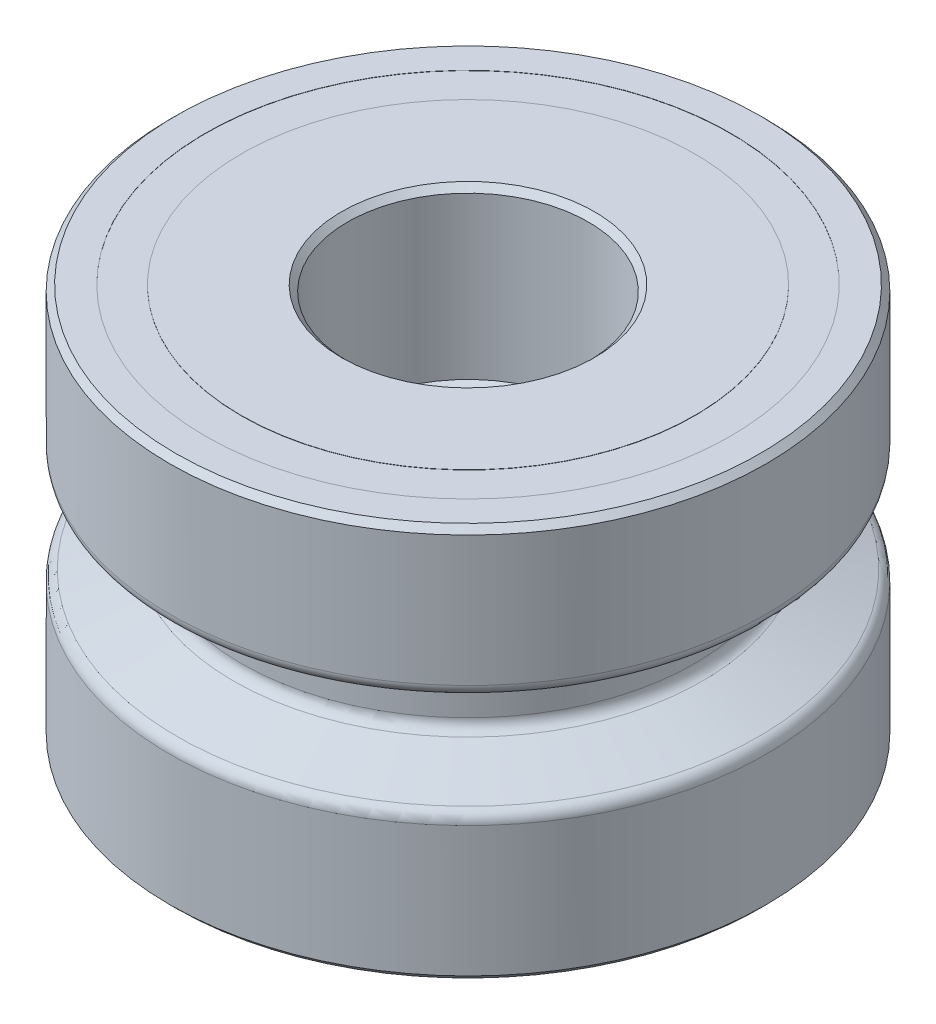
ISO-10303-21;
HEADER;
FILE_DESCRIPTION(('STEP AP214'),'2;1');
FILE_NAME('part.step','',(''),(''),'','','');
FILE_SCHEMA(('AUTOMOTIVE_DESIGN { 1 0 10303 214 1 1 1 1 }'));
ENDSEC;
DATA;
#1=APPLICATION_CONTEXT('core data for automotive mechanical design processes');
#2=APPLICATION_PROTOCOL_DEFINITION('international standard','automotive_design',2000,#1);
#3=PRODUCT_CONTEXT('',#1,'mechanical');
#4=PRODUCT('Part','Part','',(#3));
#5=PRODUCT_RELATED_PRODUCT_CATEGORY('part','',(#4));
#6=PRODUCT_DEFINITION_FORMATION('','',#4);
#7=PRODUCT_DEFINITION_CONTEXT('part definition',#1,'design');
#8=PRODUCT_DEFINITION('design','',#6,#7);
#9=PRODUCT_DEFINITION_SHAPE('','',#8);
#10=(LENGTH_UNIT() NAMED_UNIT(*) SI_UNIT(.MILLI.,.METRE.));
#11=(NAMED_UNIT(*) PLANE_ANGLE_UNIT() SI_UNIT($,.RADIAN.));
#12=(NAMED_UNIT(*) SI_UNIT($,.STERADIAN.) SOLID_ANGLE_UNIT());
#13=UNCERTAINTY_MEASURE_WITH_UNIT(LENGTH_MEASURE(1.E-05),#10,'distance_accuracy_value','');
#14=(GEOMETRIC_REPRESENTATION_CONTEXT(3) GLOBAL_UNCERTAINTY_ASSIGNED_CONTEXT((#13)) GLOBAL_UNIT_ASSIGNED_CONTEXT((#10,
#11,#12)) REPRESENTATION_CONTEXT('',''));
#15=CARTESIAN_POINT('',(0.,0.,0.));
#16=DIRECTION('',(0.,0.,1.));
#17=DIRECTION('',(1.,0.,0.));
#18=AXIS2_PLACEMENT_3D('',#15,#16,#17);
#19=CARTESIAN_POINT('',(0.,8.25,0.));
#20=DIRECTION('',(0.,-1.,0.));
#21=DIRECTION('',(0.,0.,-1.));
#22=AXIS2_PLACEMENT_3D('',#19,#20,#21);
#23=CYLINDRICAL_SURFACE('',#22,12.5);
#24=CARTESIAN_POINT('',(0.,-8.,0.));
#25=DIRECTION('',(0.,1.,0.));
#26=DIRECTION('',(0.,0.,1.));
#27=AXIS2_PLACEMENT_3D('',#24,#25,#26);
#28=CIRCLE('',#27,12.5);
#29=CARTESIAN_POINT('',(0.,-8.,12.5));
#30=VERTEX_POINT('',#29);
#31=EDGE_CURVE('E60',#30,#30,#28,.T.);
#32=ORIENTED_EDGE('',*,*,#31,.T.);
#33=EDGE_LOOP('',(#32));
#34=FACE_BOUND('',#33,.T.);
#35=CARTESIAN_POINT('',(0.,-2.54201447190344,0.));
#36=DIRECTION('',(0.,-1.,0.));
#37=DIRECTION('',(0.,0.,-1.));
#38=AXIS2_PLACEMENT_3D('',#35,#36,#37);
#39=CIRCLE('',#38,12.5);
#40=CARTESIAN_POINT('',(0.,-2.54201447190344,-12.5));
#41=VERTEX_POINT('',#40);
#42=EDGE_CURVE('E81',#41,#41,#39,.T.);
#43=ORIENTED_EDGE('',*,*,#42,.T.);
#44=EDGE_LOOP('',(#43));
#45=FACE_BOUND('',#44,.T.);
#46=ADVANCED_FACE('F44',(#34,#45),#23,.T.);
#47=CARTESIAN_POINT('',(0.,7.99999999999999,0.));
#48=DIRECTION('',(0.,1.,0.));
#49=DIRECTION('',(0.,0.,1.));
#50=AXIS2_PLACEMENT_3D('',#47,#48,#49);
#51=CIRCLE('',#50,12.5);
#52=CARTESIAN_POINT('',(0.,7.99999999999999,12.5));
#53=VERTEX_POINT('',#52);
#54=EDGE_CURVE('E10',#53,#53,#51,.F.);
#55=ORIENTED_EDGE('',*,*,#54,.T.);
#56=EDGE_LOOP('',(#55));
#57=FACE_BOUND('',#56,.T.);
#58=CARTESIAN_POINT('',(0.,2.54201447190344,0.));
#59=DIRECTION('',(0.,-1.,0.));
#60=DIRECTION('',(0.,0.,-1.));
#61=AXIS2_PLACEMENT_3D('',#58,#59,#60);
#62=CIRCLE('',#61,12.5);
#63=CARTESIAN_POINT('',(0.,2.54201447190344,-12.5));
#64=VERTEX_POINT('',#63);
#65=EDGE_CURVE('E90',#64,#64,#62,.F.);
#66=ORIENTED_EDGE('',*,*,#65,.T.);
#67=EDGE_LOOP('',(#66));
#68=FACE_BOUND('',#67,.T.);
#69=ADVANCED_FACE('F162',(#57,#68),#23,.T.);
#70=CARTESIAN_POINT('',(0.,8.25,0.));
#71=DIRECTION('',(0.,1.,0.));
#72=DIRECTION('',(0.,0.,1.));
#73=AXIS2_PLACEMENT_3D('',#70,#71,#72);
#74=PLANE('',#73);
#75=CARTESIAN_POINT('',(0.,8.25,0.));
#76=DIRECTION('',(0.,1.,0.));
#77=DIRECTION('',(0.,0.,1.));
#78=AXIS2_PLACEMENT_3D('',#75,#76,#77);
#79=CIRCLE('',#78,5.30000000000001);
#80=CARTESIAN_POINT('',(0.,8.25,5.30000000000001));
#81=VERTEX_POINT('',#80);
#82=EDGE_CURVE('E62',#81,#81,#79,.F.);
#83=ORIENTED_EDGE('',*,*,#82,.T.);
#84=EDGE_LOOP('',(#83));
#85=FACE_BOUND('',#84,.T.);
#86=CARTESIAN_POINT('',(0.,8.25,0.));
#87=DIRECTION('',(0.,1.,0.));
#88=DIRECTION('',(0.,0.,1.));
#89=AXIS2_PLACEMENT_3D('',#86,#87,#88);
#90=CIRCLE('',#89,9.5);
#91=CARTESIAN_POINT('',(0.,8.25,9.5));
#92=VERTEX_POINT('',#91);
#93=EDGE_CURVE('E125',#92,#92,#90,.T.);
#94=ORIENTED_EDGE('',*,*,#93,.T.);
#95=EDGE_LOOP('',(#94));
#96=FACE_BOUND('',#95,.T.);
#97=ADVANCED_FACE('F151',(#85,#96),#74,.T.);
#98=CARTESIAN_POINT('',(0.,8.251,0.));
#99=DIRECTION('',(0.,-1.,0.));
#100=DIRECTION('',(0.,0.,-1.));
#101=AXIS2_PLACEMENT_3D('',#98,#99,#100);
#102=CYLINDRICAL_SURFACE('',#101,4.);
#103=CARTESIAN_POINT('',(0.,-4.00000000000001,0.));
#104=DIRECTION('',(0.,-1.,0.));
#105=DIRECTION('',(0.,0.,-1.));
#106=AXIS2_PLACEMENT_3D('',#103,#104,#105);
#107=CIRCLE('',#106,4.);
#108=CARTESIAN_POINT('',(0.,-4.00000000000001,-4.));
#109=VERTEX_POINT('',#108);
#110=EDGE_CURVE('E76',#109,#109,#107,.T.);
#111=ORIENTED_EDGE('',*,*,#110,.T.);
#112=EDGE_LOOP('',(#111));
#113=FACE_BOUND('',#112,.T.);
#114=CARTESIAN_POINT('',(0.,0.749999999999993,0.));
#115=DIRECTION('',(0.,1.,0.));
#116=DIRECTION('',(0.,0.,1.));
#117=AXIS2_PLACEMENT_3D('',#114,#115,#116);
#118=CIRCLE('',#117,4.);
#119=CARTESIAN_POINT('',(0.,0.749999999999993,4.));
#120=VERTEX_POINT('',#119);
#121=EDGE_CURVE('E111',#120,#120,#118,.T.);
#122=ORIENTED_EDGE('',*,*,#121,.T.);
#123=EDGE_LOOP('',(#122));
#124=FACE_BOUND('',#123,.T.);
#125=ADVANCED_FACE('F146',(#113,#124),#102,.F.);
#126=CARTESIAN_POINT('',(0.,8.25,0.));
#127=DIRECTION('',(0.,1.,0.));
#128=DIRECTION('',(0.,0.,1.));
#129=AXIS2_PLACEMENT_3D('',#126,#127,#128);
#130=CIRCLE('',#129,12.25);
#131=CARTESIAN_POINT('',(0.,8.25,12.25));
#132=VERTEX_POINT('',#131);
#133=EDGE_CURVE('E52',#132,#132,#130,.T.);
#134=ORIENTED_EDGE('',*,*,#133,.T.);
#135=EDGE_LOOP('',(#134));
#136=FACE_BOUND('',#135,.T.);
#137=CARTESIAN_POINT('',(0.,8.25,0.));
#138=DIRECTION('',(0.,1.,0.));
#139=DIRECTION('',(0.,0.,1.));
#140=AXIS2_PLACEMENT_3D('',#137,#138,#139);
#141=CIRCLE('',#140,11.);
#142=CARTESIAN_POINT('',(0.,8.25,11.));
#143=VERTEX_POINT('',#142);
#144=EDGE_CURVE('E117',#143,#143,#141,.T.);
#145=ORIENTED_EDGE('',*,*,#144,.F.);
#146=EDGE_LOOP('',(#145));
#147=FACE_BOUND('',#146,.T.);
#148=ADVANCED_FACE('F147',(#136,#147),#74,.T.);
#149=CARTESIAN_POINT('',(0.,-8.25,0.));
#150=DIRECTION('',(0.,1.,0.));
#151=DIRECTION('',(0.,0.,1.));
#152=AXIS2_PLACEMENT_3D('',#149,#150,#151);
#153=PLANE('',#152);
#154=CARTESIAN_POINT('',(0.,-8.25,0.));
#155=DIRECTION('',(0.,1.,0.));
#156=DIRECTION('',(0.,0.,1.));
#157=AXIS2_PLACEMENT_3D('',#154,#155,#156);
#158=CIRCLE('',#157,5.30000000000001);
#159=CARTESIAN_POINT('',(0.,-8.25,5.30000000000001));
#160=VERTEX_POINT('',#159);
#161=EDGE_CURVE('E67',#160,#160,#158,.T.);
#162=ORIENTED_EDGE('',*,*,#161,.T.);
#163=EDGE_LOOP('',(#162));
#164=FACE_BOUND('',#163,.T.);
#165=CARTESIAN_POINT('',(0.,-8.25,0.));
#166=DIRECTION('',(0.,1.,0.));
#167=DIRECTION('',(0.,0.,1.));
#168=AXIS2_PLACEMENT_3D('',#165,#166,#167);
#169=CIRCLE('',#168,12.25);
#170=CARTESIAN_POINT('',(0.,-8.25,12.25));
#171=VERTEX_POINT('',#170);
#172=EDGE_CURVE('E71',#171,#171,#169,.F.);
#173=ORIENTED_EDGE('',*,*,#172,.T.);
#174=EDGE_LOOP('',(#173));
#175=FACE_BOUND('',#174,.T.);
#176=ADVANCED_FACE('F150',(#164,#175),#153,.F.);
#177=CARTESIAN_POINT('',(0.,-4.25,0.));
#178=DIRECTION('',(0.,-1.,0.));
#179=DIRECTION('',(0.,0.,-1.));
#180=AXIS2_PLACEMENT_3D('',#177,#178,#179);
#181=PLANE('',#180);
#182=CARTESIAN_POINT('',(0.,-4.25,0.));
#183=DIRECTION('',(0.,-1.,0.));
#184=DIRECTION('',(0.,0.,-1.));
#185=AXIS2_PLACEMENT_3D('',#182,#183,#184);
#186=CIRCLE('',#185,4.24999999999999);
#187=CARTESIAN_POINT('',(0.,-4.25,-4.24999999999999));
#188=VERTEX_POINT('',#187);
#189=EDGE_CURVE('E82',#188,#188,#186,.F.);
#190=ORIENTED_EDGE('',*,*,#189,.T.);
#191=EDGE_LOOP('',(#190));
#192=FACE_BOUND('',#191,.T.);
#193=CARTESIAN_POINT('',(0.,-4.25,0.));
#194=DIRECTION('',(0.,-1.,0.));
#195=DIRECTION('',(0.,0.,-1.));
#196=AXIS2_PLACEMENT_3D('',#193,#194,#195);
#197=CIRCLE('',#196,5.05);
#198=CARTESIAN_POINT('',(0.,-4.25,-5.05));
#199=VERTEX_POINT('',#198);
#200=EDGE_CURVE('E112',#199,#199,#197,.T.);
#201=ORIENTED_EDGE('',*,*,#200,.T.);
#202=EDGE_LOOP('',(#201));
#203=FACE_BOUND('',#202,.T.);
#204=ADVANCED_FACE('F159',(#192,#203),#181,.T.);
#205=CARTESIAN_POINT('',(0.,-4.25,0.));
#206=DIRECTION('',(0.,-1.,0.));
#207=DIRECTION('',(0.,0.,-1.));
#208=AXIS2_PLACEMENT_3D('',#205,#206,#207);
#209=CYLINDRICAL_SURFACE('',#208,5.05);
#210=CARTESIAN_POINT('',(0.,-8.,0.));
#211=DIRECTION('',(0.,1.,0.));
#212=DIRECTION('',(0.,0.,1.));
#213=AXIS2_PLACEMENT_3D('',#210,#211,#212);
#214=CIRCLE('',#213,5.05);
#215=CARTESIAN_POINT('',(0.,-8.,5.05));
#216=VERTEX_POINT('',#215);
#217=EDGE_CURVE('E72',#216,#216,#214,.F.);
#218=ORIENTED_EDGE('',*,*,#217,.T.);
#219=EDGE_LOOP('',(#218));
#220=FACE_BOUND('',#219,.T.);
#221=ORIENTED_EDGE('',*,*,#200,.F.);
#222=EDGE_LOOP('',(#221));
#223=FACE_BOUND('',#222,.T.);
#224=ADVANCED_FACE('F363',(#220,#223),#209,.F.);
#225=CARTESIAN_POINT('',(0.,1.25,0.));
#226=DIRECTION('',(0.,1.,0.));
#227=DIRECTION('',(0.,0.,1.));
#228=AXIS2_PLACEMENT_3D('',#225,#226,#227);
#229=CYLINDRICAL_SURFACE('',#228,5.05);
#230=CARTESIAN_POINT('',(0.,8.,0.));
#231=DIRECTION('',(0.,1.,0.));
#232=DIRECTION('',(0.,0.,1.));
#233=AXIS2_PLACEMENT_3D('',#230,#231,#232);
#234=CIRCLE('',#233,5.05);
#235=CARTESIAN_POINT('',(0.,8.,5.05));
#236=VERTEX_POINT('',#235);
#237=EDGE_CURVE('E66',#236,#236,#234,.T.);
#238=ORIENTED_EDGE('',*,*,#237,.T.);
#239=EDGE_LOOP('',(#238));
#240=FACE_BOUND('',#239,.T.);
#241=CARTESIAN_POINT('',(0.,1.23962304106274,0.));
#242=DIRECTION('',(0.,1.,0.));
#243=DIRECTION('',(0.,0.,1.));
#244=AXIS2_PLACEMENT_3D('',#241,#242,#243);
#245=CIRCLE('',#244,5.05);
#246=CARTESIAN_POINT('',(0.,1.23962304106274,5.05));
#247=VERTEX_POINT('',#246);
#248=EDGE_CURVE('E108',#247,#247,#245,.F.);
#249=ORIENTED_EDGE('',*,*,#248,.T.);
#250=EDGE_LOOP('',(#249));
#251=FACE_BOUND('',#250,.T.);
#252=ADVANCED_FACE('F350',(#240,#251),#229,.F.);
#253=CARTESIAN_POINT('',(0.,8.24,0.));
#254=DIRECTION('',(0.,1.,0.));
#255=DIRECTION('',(0.,0.,1.));
#256=AXIS2_PLACEMENT_3D('',#253,#254,#255);
#257=CYLINDRICAL_SURFACE('',#256,9.5);
#258=CARTESIAN_POINT('',(0.,8.24,0.));
#259=DIRECTION('',(0.,1.,0.));
#260=DIRECTION('',(0.,0.,1.));
#261=AXIS2_PLACEMENT_3D('',#258,#259,#260);
#262=CIRCLE('',#261,9.5);
#263=CARTESIAN_POINT('',(0.,8.24,9.5));
#264=VERTEX_POINT('',#263);
#265=EDGE_CURVE('E122',#264,#264,#262,.T.);
#266=CARTESIAN_POINT('',(0.,8.24,9.5));
#267=CARTESIAN_POINT('',(0.,8.24010416666667,9.5));
#268=CARTESIAN_POINT('',(0.,8.24020833333333,9.5));
#269=CARTESIAN_POINT('',(0.,8.24041666666667,9.5));
#270=CARTESIAN_POINT('',(0.,8.24052083333333,9.5));
#271=CARTESIAN_POINT('',(0.,8.24072916666667,9.5));
#272=CARTESIAN_POINT('',(0.,8.24083333333333,9.5));
#273=CARTESIAN_POINT('',(0.,8.24104166666667,9.5));
#274=CARTESIAN_POINT('',(0.,8.24114583333333,9.5));
#275=CARTESIAN_POINT('',(0.,8.24135416666667,9.5));
#276=CARTESIAN_POINT('',(0.,8.24145833333333,9.5));
#277=CARTESIAN_POINT('',(0.,8.24166666666667,9.5));
#278=CARTESIAN_POINT('',(0.,8.24177083333333,9.5));
#279=CARTESIAN_POINT('',(0.,8.24197916666667,9.5));
#280=CARTESIAN_POINT('',(0.,8.24208333333333,9.5));
#281=CARTESIAN_POINT('',(0.,8.24229166666667,9.5));
#282=CARTESIAN_POINT('',(0.,8.24239583333333,9.5));
#283=CARTESIAN_POINT('',(0.,8.24260416666667,9.5));
#284=CARTESIAN_POINT('',(0.,8.24270833333333,9.5));
#285=CARTESIAN_POINT('',(0.,8.24291666666667,9.5));
#286=CARTESIAN_POINT('',(0.,8.24302083333333,9.5));
#287=CARTESIAN_POINT('',(0.,8.24322916666667,9.5));
#288=CARTESIAN_POINT('',(0.,8.24333333333333,9.5));
#289=CARTESIAN_POINT('',(0.,8.24354166666667,9.5));
#290=CARTESIAN_POINT('',(0.,8.24364583333333,9.5));
#291=CARTESIAN_POINT('',(0.,8.24385416666667,9.5));
#292=CARTESIAN_POINT('',(0.,8.24395833333333,9.5));
#293=CARTESIAN_POINT('',(0.,8.24416666666667,9.5));
#294=CARTESIAN_POINT('',(0.,8.24427083333333,9.5));
#295=CARTESIAN_POINT('',(0.,8.24447916666667,9.5));
#296=CARTESIAN_POINT('',(0.,8.24458333333333,9.5));
#297=CARTESIAN_POINT('',(0.,8.24479166666667,9.5));
#298=CARTESIAN_POINT('',(0.,8.24489583333333,9.5));
#299=CARTESIAN_POINT('',(0.,8.24510416666667,9.5));
#300=CARTESIAN_POINT('',(0.,8.24520833333333,9.5));
#301=CARTESIAN_POINT('',(0.,8.24541666666667,9.5));
#302=CARTESIAN_POINT('',(0.,8.24552083333333,9.5));
#303=CARTESIAN_POINT('',(0.,8.24572916666667,9.5));
#304=CARTESIAN_POINT('',(0.,8.24583333333333,9.5));
#305=CARTESIAN_POINT('',(0.,8.24604166666667,9.5));
#306=CARTESIAN_POINT('',(0.,8.24614583333333,9.5));
#307=CARTESIAN_POINT('',(0.,8.24635416666667,9.5));
#308=CARTESIAN_POINT('',(0.,8.24645833333333,9.5));
#309=CARTESIAN_POINT('',(0.,8.24666666666667,9.5));
#310=CARTESIAN_POINT('',(0.,8.24677083333333,9.5));
#311=CARTESIAN_POINT('',(0.,8.24697916666667,9.5));
#312=CARTESIAN_POINT('',(0.,8.24708333333333,9.5));
#313=CARTESIAN_POINT('',(0.,8.24729166666667,9.5));
#314=CARTESIAN_POINT('',(0.,8.24739583333333,9.5));
#315=CARTESIAN_POINT('',(0.,8.24760416666667,9.5));
#316=CARTESIAN_POINT('',(0.,8.24770833333333,9.5));
#317=CARTESIAN_POINT('',(0.,8.24791666666667,9.5));
#318=CARTESIAN_POINT('',(0.,8.24802083333333,9.5));
#319=CARTESIAN_POINT('',(0.,8.24822916666667,9.5));
#320=CARTESIAN_POINT('',(0.,8.24833333333333,9.5));
#321=CARTESIAN_POINT('',(0.,8.24854166666667,9.5));
#322=CARTESIAN_POINT('',(0.,8.24864583333333,9.5));
#323=CARTESIAN_POINT('',(0.,8.24885416666667,9.5));
#324=CARTESIAN_POINT('',(0.,8.24895833333333,9.5));
#325=CARTESIAN_POINT('',(0.,8.24916666666667,9.5));
#326=CARTESIAN_POINT('',(0.,8.24927083333333,9.5));
#327=CARTESIAN_POINT('',(0.,8.24947916666667,9.5));
#328=CARTESIAN_POINT('',(0.,8.24958333333333,9.5));
#329=CARTESIAN_POINT('',(0.,8.24979166666667,9.5));
#330=CARTESIAN_POINT('',(0.,8.24989583333333,9.5));
#331=CARTESIAN_POINT('',(0.,8.25,9.5));
#332=B_SPLINE_CURVE_WITH_KNOTS('',3,(#266,#267,#268,#269,#270,#271,#272,#273,#274,#275,#276,
#277,#278,#279,#280,#281,#282,#283,#284,#285,#286,#287,#288,#289,#290,#291,#292,#293,#294,#295,
#296,#297,#298,#299,#300,#301,#302,#303,#304,#305,#306,#307,#308,#309,#310,#311,#312,#313,#314,
#315,#316,#317,#318,#319,#320,#321,#322,#323,#324,#325,#326,#327,#328,#329,#330,#331),
.UNSPECIFIED.,.F.,.F.,(4,2,2,2,2,2,2,2,2,2,2,2,2,2,2,2,2,2,2,2,2,2,2,2,2,2,2,2,2,2,2,2,4),(0.,
0.000312499999998578,0.00062499999999889,0.000937499999999203,0.00124999999999952,
0.00156249999999983,0.00187499999999841,0.00218749999999872,0.00249999999999903,
0.00281249999999934,0.00312499999999966,0.00343749999999823,0.00374999999999855,
0.00406249999999886,0.00437499999999917,0.00468749999999948,0.00499999999999806,
0.00531249999999837,0.00562499999999869,0.005937499999999,0.00624999999999931,
0.00656249999999962,0.0068749999999982,0.00718749999999851,0.00749999999999883,
0.00781249999999914,0.00812499999999945,0.00843749999999803,0.00874999999999834,
0.00906249999999865,0.00937499999999897,0.00968749999999928,0.00999999999999786),.UNSPECIFIED.);
#333=EDGE_CURVE('BSEAM128',#264,#92,#332,.T.);
#334=ORIENTED_EDGE('',*,*,#265,.T.);
#335=ORIENTED_EDGE('',*,*,#93,.F.);
#336=ORIENTED_EDGE('',*,*,#333,.T.);
#337=ORIENTED_EDGE('',*,*,#333,.F.);
#338=EDGE_LOOP('',(#334,#336,#335,#337));
#339=FACE_BOUND('',#338,.T.);
#340=ADVANCED_FACE('F128',(#339),#257,.T.);
#341=CARTESIAN_POINT('',(0.,8.24,0.));
#342=DIRECTION('',(0.,1.,0.));
#343=DIRECTION('',(0.,0.,1.));
#344=AXIS2_PLACEMENT_3D('',#341,#342,#343);
#345=CYLINDRICAL_SURFACE('',#344,11.);
#346=CARTESIAN_POINT('',(0.,8.24,0.));
#347=DIRECTION('',(0.,1.,0.));
#348=DIRECTION('',(0.,0.,1.));
#349=AXIS2_PLACEMENT_3D('',#346,#347,#348);
#350=CIRCLE('',#349,11.);
#351=CARTESIAN_POINT('',(0.,8.24,11.));
#352=VERTEX_POINT('',#351);
#353=EDGE_CURVE('E120',#352,#352,#350,.T.);
#354=CARTESIAN_POINT('',(0.,8.24,11.));
#355=CARTESIAN_POINT('',(0.,8.24010416666667,11.));
#356=CARTESIAN_POINT('',(0.,8.24020833333333,11.));
#357=CARTESIAN_POINT('',(0.,8.24041666666667,11.));
#358=CARTESIAN_POINT('',(0.,8.24052083333333,11.));
#359=CARTESIAN_POINT('',(0.,8.24072916666667,11.));
#360=CARTESIAN_POINT('',(0.,8.24083333333333,11.));
#361=CARTESIAN_POINT('',(0.,8.24104166666667,11.));
#362=CARTESIAN_POINT('',(0.,8.24114583333333,11.));
#363=CARTESIAN_POINT('',(0.,8.24135416666667,11.));
#364=CARTESIAN_POINT('',(0.,8.24145833333333,11.));
#365=CARTESIAN_POINT('',(0.,8.24166666666667,11.));
#366=CARTESIAN_POINT('',(0.,8.24177083333333,11.));
#367=CARTESIAN_POINT('',(0.,8.24197916666667,11.));
#368=CARTESIAN_POINT('',(0.,8.24208333333333,11.));
#369=CARTESIAN_POINT('',(0.,8.24229166666667,11.));
#370=CARTESIAN_POINT('',(0.,8.24239583333333,11.));
#371=CARTESIAN_POINT('',(0.,8.24260416666667,11.));
#372=CARTESIAN_POINT('',(0.,8.24270833333333,11.));
#373=CARTESIAN_POINT('',(0.,8.24291666666667,11.));
#374=CARTESIAN_POINT('',(0.,8.24302083333333,11.));
#375=CARTESIAN_POINT('',(0.,8.24322916666667,11.));
#376=CARTESIAN_POINT('',(0.,8.24333333333333,11.));
#377=CARTESIAN_POINT('',(0.,8.24354166666667,11.));
#378=CARTESIAN_POINT('',(0.,8.24364583333333,11.));
#379=CARTESIAN_POINT('',(0.,8.24385416666667,11.));
#380=CARTESIAN_POINT('',(0.,8.24395833333333,11.));
#381=CARTESIAN_POINT('',(0.,8.24416666666667,11.));
#382=CARTESIAN_POINT('',(0.,8.24427083333333,11.));
#383=CARTESIAN_POINT('',(0.,8.24447916666667,11.));
#384=CARTESIAN_POINT('',(0.,8.24458333333333,11.));
#385=CARTESIAN_POINT('',(0.,8.24479166666667,11.));
#386=CARTESIAN_POINT('',(0.,8.24489583333333,11.));
#387=CARTESIAN_POINT('',(0.,8.24510416666667,11.));
#388=CARTESIAN_POINT('',(0.,8.24520833333333,11.));
#389=CARTESIAN_POINT('',(0.,8.24541666666667,11.));
#390=CARTESIAN_POINT('',(0.,8.24552083333333,11.));
#391=CARTESIAN_POINT('',(0.,8.24572916666667,11.));
#392=CARTESIAN_POINT('',(0.,8.24583333333333,11.));
#393=CARTESIAN_POINT('',(0.,8.24604166666667,11.));
#394=CARTESIAN_POINT('',(0.,8.24614583333333,11.));
#395=CARTESIAN_POINT('',(0.,8.24635416666667,11.));
#396=CARTESIAN_POINT('',(0.,8.24645833333333,11.));
#397=CARTESIAN_POINT('',(0.,8.24666666666667,11.));
#398=CARTESIAN_POINT('',(0.,8.24677083333333,11.));
#399=CARTESIAN_POINT('',(0.,8.24697916666667,11.));
#400=CARTESIAN_POINT('',(0.,8.24708333333333,11.));
#401=CARTESIAN_POINT('',(0.,8.24729166666667,11.));
#402=CARTESIAN_POINT('',(0.,8.24739583333333,11.));
#403=CARTESIAN_POINT('',(0.,8.24760416666667,11.));
#404=CARTESIAN_POINT('',(0.,8.24770833333333,11.));
#405=CARTESIAN_POINT('',(0.,8.24791666666667,11.));
#406=CARTESIAN_POINT('',(0.,8.24802083333333,11.));
#407=CARTESIAN_POINT('',(0.,8.24822916666667,11.));
#408=CARTESIAN_POINT('',(0.,8.24833333333333,11.));
#409=CARTESIAN_POINT('',(0.,8.24854166666667,11.));
#410=CARTESIAN_POINT('',(0.,8.24864583333333,11.));
#411=CARTESIAN_POINT('',(0.,8.24885416666667,11.));
#412=CARTESIAN_POINT('',(0.,8.24895833333333,11.));
#413=CARTESIAN_POINT('',(0.,8.24916666666667,11.));
#414=CARTESIAN_POINT('',(0.,8.24927083333333,11.));
#415=CARTESIAN_POINT('',(0.,8.24947916666667,11.));
#416=CARTESIAN_POINT('',(0.,8.24958333333333,11.));
#417=CARTESIAN_POINT('',(0.,8.24979166666667,11.));
#418=CARTESIAN_POINT('',(0.,8.24989583333333,11.));
#419=CARTESIAN_POINT('',(0.,8.25,11.));
#420=B_SPLINE_CURVE_WITH_KNOTS('',3,(#354,#355,#356,#357,#358,#359,#360,#361,#362,#363,#364,
#365,#366,#367,#368,#369,#370,#371,#372,#373,#374,#375,#376,#377,#378,#379,#380,#381,#382,#383,
#384,#385,#386,#387,#388,#389,#390,#391,#392,#393,#394,#395,#396,#397,#398,#399,#400,#401,#402,
#403,#404,#405,#406,#407,#408,#409,#410,#411,#412,#413,#414,#415,#416,#417,#418,#419),
.UNSPECIFIED.,.F.,.F.,(4,2,2,2,2,2,2,2,2,2,2,2,2,2,2,2,2,2,2,2,2,2,2,2,2,2,2,2,2,2,2,2,4),(0.,
0.000312499999998578,0.00062499999999889,0.000937499999999203,0.00124999999999952,
0.00156249999999983,0.00187499999999841,0.00218749999999872,0.00249999999999903,
0.00281249999999934,0.00312499999999966,0.00343749999999823,0.00374999999999855,
0.00406249999999886,0.00437499999999917,0.00468749999999948,0.00499999999999806,
0.00531249999999837,0.00562499999999869,0.005937499999999,0.00624999999999931,
0.00656249999999962,0.0068749999999982,0.00718749999999851,0.00749999999999883,
0.00781249999999914,0.00812499999999945,0.00843749999999803,0.00874999999999834,
0.00906249999999865,0.00937499999999897,0.00968749999999928,0.00999999999999786),.UNSPECIFIED.);
#421=EDGE_CURVE('BSEAM136',#352,#143,#420,.T.);
#422=ORIENTED_EDGE('',*,*,#353,.F.);
#423=ORIENTED_EDGE('',*,*,#144,.T.);
#424=ORIENTED_EDGE('',*,*,#421,.T.);
#425=ORIENTED_EDGE('',*,*,#421,.F.);
#426=EDGE_LOOP('',(#422,#424,#423,#425));
#427=FACE_BOUND('',#426,.T.);
#428=ADVANCED_FACE('F136',(#427),#345,.F.);
#429=CARTESIAN_POINT('',(0.,8.24,0.));
#430=DIRECTION('',(0.,1.,0.));
#431=DIRECTION('',(0.,0.,1.));
#432=AXIS2_PLACEMENT_3D('',#429,#430,#431);
#433=PLANE('',#432);
#434=ORIENTED_EDGE('',*,*,#265,.F.);
#435=EDGE_LOOP('',(#434));
#436=FACE_BOUND('',#435,.T.);
#437=ORIENTED_EDGE('',*,*,#353,.T.);
#438=EDGE_LOOP('',(#437));
#439=FACE_BOUND('',#438,.T.);
#440=ADVANCED_FACE('F133',(#436,#439),#433,.T.);
#441=CARTESIAN_POINT('',(0.,-1.1,0.));
#442=DIRECTION('',(0.,-1.,0.));
#443=DIRECTION('',(0.,0.,-1.));
#444=AXIS2_PLACEMENT_3D('',#441,#442,#443);
#445=CONICAL_SURFACE('',#444,9.5,1.22173047639604);
#446=CARTESIAN_POINT('',(0.,-1.2197425412881,0.));
#447=DIRECTION('',(0.,-1.,0.));
#448=DIRECTION('',(0.,0.,-1.));
#449=AXIS2_PLACEMENT_3D('',#446,#447,#448);
#450=CIRCLE('',#449,9.82898992833717);
#451=CARTESIAN_POINT('',(0.,-1.2197425412881,-9.82898992833717));
#452=VERTEX_POINT('',#451);
#453=EDGE_CURVE('E98',#452,#452,#450,.T.);
#454=ORIENTED_EDGE('',*,*,#453,.T.);
#455=EDGE_LOOP('',(#454));
#456=FACE_BOUND('',#455,.T.);
#457=CARTESIAN_POINT('',(0.,-2.07216816151048,0.));
#458=DIRECTION('',(0.,-1.,0.));
#459=DIRECTION('',(0.,0.,-1.));
#460=AXIS2_PLACEMENT_3D('',#457,#458,#459);
#461=CIRCLE('',#460,12.1710100716628);
#462=CARTESIAN_POINT('',(0.,-2.07216816151048,-12.1710100716628));
#463=VERTEX_POINT('',#462);
#464=EDGE_CURVE('E100',#463,#463,#461,.F.);
#465=ORIENTED_EDGE('',*,*,#464,.T.);
#466=EDGE_LOOP('',(#465));
#467=FACE_BOUND('',#466,.T.);
#468=ADVANCED_FACE('F139',(#456,#467),#445,.T.);
#469=CARTESIAN_POINT('',(0.,8.25,0.));
#470=DIRECTION('',(0.,1.,0.));
#471=DIRECTION('',(0.,0.,1.));
#472=AXIS2_PLACEMENT_3D('',#469,#470,#471);
#473=CYLINDRICAL_SURFACE('',#472,9.5);
#474=CARTESIAN_POINT('',(0.,-0.749896230895143,0.));
#475=DIRECTION('',(0.,1.,0.));
#476=DIRECTION('',(0.,0.,1.));
#477=AXIS2_PLACEMENT_3D('',#474,#475,#476);
#478=CIRCLE('',#477,9.5);
#479=CARTESIAN_POINT('',(0.,-0.749896230895143,9.5));
#480=VERTEX_POINT('',#479);
#481=EDGE_CURVE('E105',#480,#480,#478,.T.);
#482=ORIENTED_EDGE('',*,*,#481,.T.);
#483=EDGE_LOOP('',(#482));
#484=FACE_BOUND('',#483,.T.);
#485=CARTESIAN_POINT('',(0.,0.749896230895143,0.));
#486=DIRECTION('',(0.,1.,0.));
#487=DIRECTION('',(0.,0.,1.));
#488=AXIS2_PLACEMENT_3D('',#485,#486,#487);
#489=CIRCLE('',#488,9.5);
#490=CARTESIAN_POINT('',(0.,0.749896230895143,9.5));
#491=VERTEX_POINT('',#490);
#492=EDGE_CURVE('E102',#491,#491,#489,.F.);
#493=ORIENTED_EDGE('',*,*,#492,.T.);
#494=EDGE_LOOP('',(#493));
#495=FACE_BOUND('',#494,.T.);
#496=ADVANCED_FACE('F296',(#484,#495),#473,.T.);
#497=CARTESIAN_POINT('',(0.,2.19191070279859,0.));
#498=DIRECTION('',(0.,1.,0.));
#499=DIRECTION('',(0.,0.,1.));
#500=AXIS2_PLACEMENT_3D('',#497,#498,#499);
#501=CONICAL_SURFACE('',#500,12.5,1.22173047639604);
#502=CARTESIAN_POINT('',(0.,1.2197425412881,0.));
#503=DIRECTION('',(0.,1.,0.));
#504=DIRECTION('',(0.,0.,1.));
#505=AXIS2_PLACEMENT_3D('',#502,#503,#504);
#506=CIRCLE('',#505,9.82898992833717);
#507=CARTESIAN_POINT('',(0.,1.2197425412881,9.82898992833717));
#508=VERTEX_POINT('',#507);
#509=EDGE_CURVE('E89',#508,#508,#506,.T.);
#510=ORIENTED_EDGE('',*,*,#509,.T.);
#511=EDGE_LOOP('',(#510));
#512=FACE_BOUND('',#511,.T.);
#513=CARTESIAN_POINT('',(0.,2.07216816151048,0.));
#514=DIRECTION('',(0.,1.,0.));
#515=DIRECTION('',(0.,0.,1.));
#516=AXIS2_PLACEMENT_3D('',#513,#514,#515);
#517=CIRCLE('',#516,12.1710100716628);
#518=CARTESIAN_POINT('',(0.,2.07216816151048,12.1710100716628));
#519=VERTEX_POINT('',#518);
#520=EDGE_CURVE('E95',#519,#519,#517,.F.);
#521=ORIENTED_EDGE('',*,*,#520,.T.);
#522=EDGE_LOOP('',(#521));
#523=FACE_BOUND('',#522,.T.);
#524=ADVANCED_FACE('F181',(#512,#523),#501,.T.);
#525=CARTESIAN_POINT('',(0.,1.25,0.));
#526=DIRECTION('',(0.,1.,0.));
#527=DIRECTION('',(0.,0.,1.));
#528=AXIS2_PLACEMENT_3D('',#525,#526,#527);
#529=CONICAL_SURFACE('',#528,5.0722534602548,1.13446401379632);
#530=ORIENTED_EDGE('',*,*,#121,.F.);
#531=EDGE_LOOP('',(#530));
#532=FACE_BOUND('',#531,.T.);
#533=ORIENTED_EDGE('',*,*,#248,.F.);
#534=EDGE_LOOP('',(#533));
#535=FACE_BOUND('',#534,.T.);
#536=ADVANCED_FACE('F172',(#532,#535),#529,.F.);
#537=CARTESIAN_POINT('',(0.,-0.749896230895143,0.));
#538=DIRECTION('',(0.,1.,0.));
#539=DIRECTION('',(0.,0.,1.));
#540=AXIS2_PLACEMENT_3D('',#537,#538,#539);
#541=TOROIDAL_SURFACE('',#540,10.,0.5);
#542=ORIENTED_EDGE('',*,*,#453,.F.);
#543=EDGE_LOOP('',(#542));
#544=FACE_BOUND('',#543,.T.);
#545=ORIENTED_EDGE('',*,*,#481,.F.);
#546=EDGE_LOOP('',(#545));
#547=FACE_BOUND('',#546,.T.);
#548=ADVANCED_FACE('F179',(#544,#547),#541,.F.);
#549=CARTESIAN_POINT('',(0.,0.749896230895143,0.));
#550=DIRECTION('',(0.,1.,0.));
#551=DIRECTION('',(0.,0.,1.));
#552=AXIS2_PLACEMENT_3D('',#549,#550,#551);
#553=TOROIDAL_SURFACE('',#552,10.,0.5);
#554=ORIENTED_EDGE('',*,*,#492,.F.);
#555=EDGE_LOOP('',(#554));
#556=FACE_BOUND('',#555,.T.);
#557=ORIENTED_EDGE('',*,*,#509,.F.);
#558=EDGE_LOOP('',(#557));
#559=FACE_BOUND('',#558,.T.);
#560=ADVANCED_FACE('F184',(#556,#559),#553,.F.);
#561=CARTESIAN_POINT('',(0.,2.54201447190344,0.));
#562=DIRECTION('',(0.,-1.,0.));
#563=DIRECTION('',(0.,0.,-1.));
#564=AXIS2_PLACEMENT_3D('',#561,#562,#563);
#565=TOROIDAL_SURFACE('',#564,12.,0.5);
#566=ORIENTED_EDGE('',*,*,#520,.F.);
#567=EDGE_LOOP('',(#566));
#568=FACE_BOUND('',#567,.T.);
#569=ORIENTED_EDGE('',*,*,#65,.F.);
#570=EDGE_LOOP('',(#569));
#571=FACE_BOUND('',#570,.T.);
#572=ADVANCED_FACE('F186',(#568,#571),#565,.T.);
#573=CARTESIAN_POINT('',(0.,-2.54201447190344,0.));
#574=DIRECTION('',(0.,-1.,0.));
#575=DIRECTION('',(0.,0.,-1.));
#576=AXIS2_PLACEMENT_3D('',#573,#574,#575);
#577=TOROIDAL_SURFACE('',#576,12.,0.5);
#578=ORIENTED_EDGE('',*,*,#42,.F.);
#579=EDGE_LOOP('',(#578));
#580=FACE_BOUND('',#579,.T.);
#581=ORIENTED_EDGE('',*,*,#464,.F.);
#582=EDGE_LOOP('',(#581));
#583=FACE_BOUND('',#582,.T.);
#584=ADVANCED_FACE('F195',(#580,#583),#577,.T.);
#585=CARTESIAN_POINT('',(0.,-4.25,0.));
#586=DIRECTION('',(0.,-1.,0.));
#587=DIRECTION('',(0.,0.,-1.));
#588=AXIS2_PLACEMENT_3D('',#585,#586,#587);
#589=CONICAL_SURFACE('',#588,4.24999999999999,0.785398163397448);
#590=ORIENTED_EDGE('',*,*,#110,.F.);
#591=EDGE_LOOP('',(#590));
#592=FACE_BOUND('',#591,.T.);
#593=ORIENTED_EDGE('',*,*,#189,.F.);
#594=EDGE_LOOP('',(#593));
#595=FACE_BOUND('',#594,.T.);
#596=ADVANCED_FACE('F196',(#592,#595),#589,.F.);
#597=CARTESIAN_POINT('',(0.,-8.,0.));
#598=DIRECTION('',(0.,-1.,0.));
#599=DIRECTION('',(0.,0.,-1.));
#600=AXIS2_PLACEMENT_3D('',#597,#598,#599);
#601=CONICAL_SURFACE('',#600,5.05,0.785398163397453);
#602=ORIENTED_EDGE('',*,*,#161,.F.);
#603=EDGE_LOOP('',(#602));
#604=FACE_BOUND('',#603,.T.);
#605=ORIENTED_EDGE('',*,*,#217,.F.);
#606=EDGE_LOOP('',(#605));
#607=FACE_BOUND('',#606,.T.);
#608=ADVANCED_FACE('F205',(#604,#607),#601,.F.);
#609=CARTESIAN_POINT('',(0.,8.,0.));
#610=DIRECTION('',(0.,1.,0.));
#611=DIRECTION('',(0.,0.,1.));
#612=AXIS2_PLACEMENT_3D('',#609,#610,#611);
#613=CONICAL_SURFACE('',#612,5.05,0.785398163397453);
#614=ORIENTED_EDGE('',*,*,#82,.F.);
#615=EDGE_LOOP('',(#614));
#616=FACE_BOUND('',#615,.T.);
#617=ORIENTED_EDGE('',*,*,#237,.F.);
#618=EDGE_LOOP('',(#617));
#619=FACE_BOUND('',#618,.T.);
#620=ADVANCED_FACE('F208',(#616,#619),#613,.F.);
#621=CARTESIAN_POINT('',(0.,-8.,0.));
#622=DIRECTION('',(0.,1.,0.));
#623=DIRECTION('',(0.,0.,1.));
#624=AXIS2_PLACEMENT_3D('',#621,#622,#623);
#625=CONICAL_SURFACE('',#624,12.5,0.785398163397459);
#626=ORIENTED_EDGE('',*,*,#172,.F.);
#627=EDGE_LOOP('',(#626));
#628=FACE_BOUND('',#627,.T.);
#629=ORIENTED_EDGE('',*,*,#31,.F.);
#630=EDGE_LOOP('',(#629));
#631=FACE_BOUND('',#630,.T.);
#632=ADVANCED_FACE('F216',(#628,#631),#625,.T.);
#633=CARTESIAN_POINT('',(0.,8.25,0.));
#634=DIRECTION('',(0.,-1.,0.));
#635=DIRECTION('',(0.,0.,-1.));
#636=AXIS2_PLACEMENT_3D('',#633,#634,#635);
#637=CONICAL_SURFACE('',#636,12.25,0.785398163397445);
#638=ORIENTED_EDGE('',*,*,#54,.F.);
#639=EDGE_LOOP('',(#638));
#640=FACE_BOUND('',#639,.T.);
#641=ORIENTED_EDGE('',*,*,#133,.F.);
#642=EDGE_LOOP('',(#641));
#643=FACE_BOUND('',#642,.T.);
#644=ADVANCED_FACE('F48',(#640,#643),#637,.T.);
#645=CLOSED_SHELL('',(#46,#69,#97,#125,#148,#176,#204,#224,#252,#340,#428,#440,#468,#496,#524,
#536,#548,#560,#572,#584,#596,#608,#620,#632,#644));
#646=MANIFOLD_SOLID_BREP('B2',#645);
#647=ADVANCED_BREP_SHAPE_REPRESENTATION('',(#18,#646),#14);
#648=SHAPE_DEFINITION_REPRESENTATION(#9,#647);
ENDSEC;
END-ISO-10303-21;
